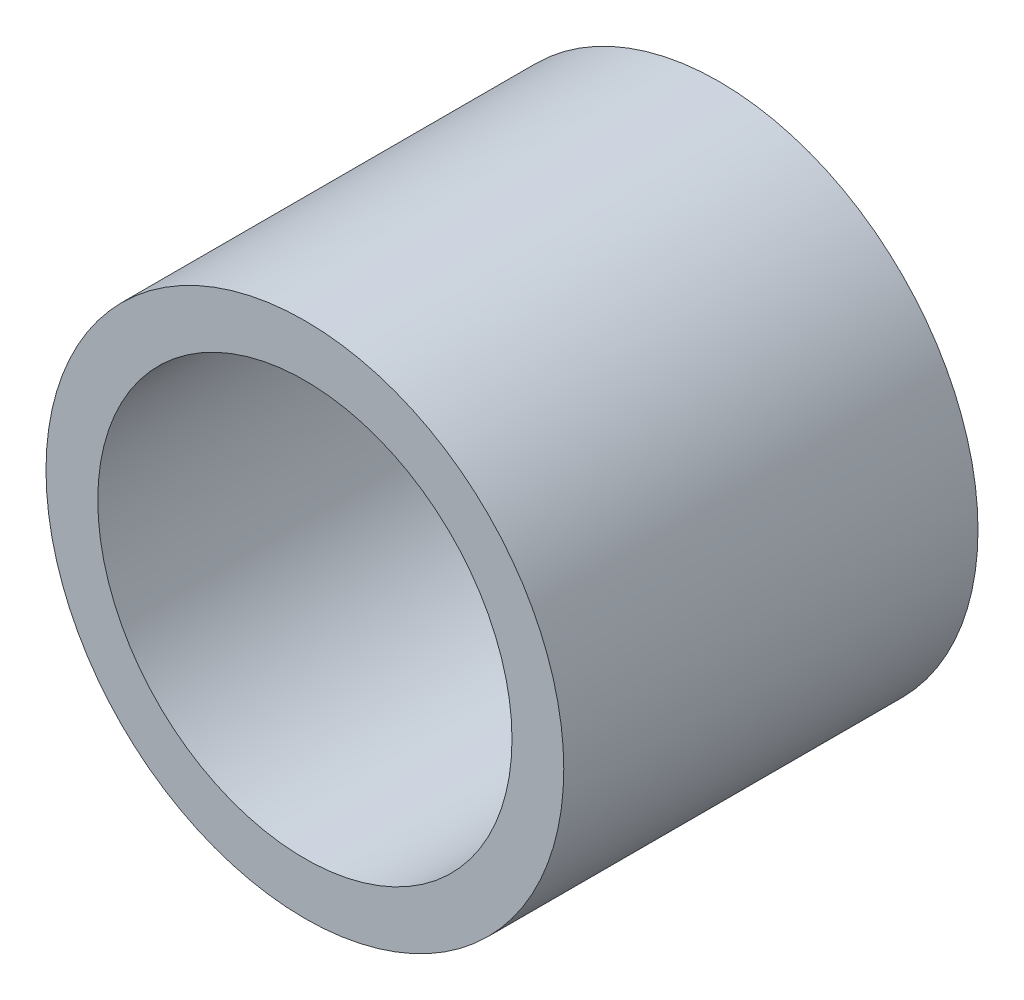
ISO-10303-21;
HEADER;
FILE_DESCRIPTION(('STEP AP214'),'2;1');
FILE_NAME('part.step','',(''),(''),'','','');
FILE_SCHEMA(('AUTOMOTIVE_DESIGN { 1 0 10303 214 1 1 1 1 }'));
ENDSEC;
DATA;
#1=APPLICATION_CONTEXT('core data for automotive mechanical design processes');
#2=APPLICATION_PROTOCOL_DEFINITION('international standard','automotive_design',2000,#1);
#3=PRODUCT_CONTEXT('',#1,'mechanical');
#4=PRODUCT('Part','Part','',(#3));
#5=PRODUCT_RELATED_PRODUCT_CATEGORY('part','',(#4));
#6=PRODUCT_DEFINITION_FORMATION('','',#4);
#7=PRODUCT_DEFINITION_CONTEXT('part definition',#1,'design');
#8=PRODUCT_DEFINITION('design','',#6,#7);
#9=PRODUCT_DEFINITION_SHAPE('','',#8);
#10=(LENGTH_UNIT() NAMED_UNIT(*) SI_UNIT(.MILLI.,.METRE.));
#11=(NAMED_UNIT(*) PLANE_ANGLE_UNIT() SI_UNIT($,.RADIAN.));
#12=(NAMED_UNIT(*) SI_UNIT($,.STERADIAN.) SOLID_ANGLE_UNIT());
#13=UNCERTAINTY_MEASURE_WITH_UNIT(LENGTH_MEASURE(1.E-05),#10,'distance_accuracy_value','');
#14=(GEOMETRIC_REPRESENTATION_CONTEXT(3) GLOBAL_UNCERTAINTY_ASSIGNED_CONTEXT((#13)) GLOBAL_UNIT_ASSIGNED_CONTEXT((#10,
#11,#12)) REPRESENTATION_CONTEXT('',''));
#15=CARTESIAN_POINT('',(0.,0.,0.));
#16=DIRECTION('',(0.,0.,1.));
#17=DIRECTION('',(1.,0.,0.));
#18=AXIS2_PLACEMENT_3D('',#15,#16,#17);
#19=CARTESIAN_POINT('',(0.,63.6713610367748,12.));
#20=DIRECTION('',(0.,0.,1.));
#21=DIRECTION('',(1.,0.,0.));
#22=AXIS2_PLACEMENT_3D('',#19,#20,#21);
#23=PLANE('',#22);
#24=CARTESIAN_POINT('',(0.,63.6713610367748,12.));
#25=DIRECTION('',(0.,0.,1.));
#26=DIRECTION('',(1.,0.,0.));
#27=AXIS2_PLACEMENT_3D('',#24,#25,#26);
#28=CIRCLE('',#27,7.49999999999994);
#29=CARTESIAN_POINT('',(7.49999999999997,63.6713610367748,12.));
#30=VERTEX_POINT('',#29);
#31=EDGE_CURVE('E10',#30,#30,#28,.T.);
#32=ORIENTED_EDGE('',*,*,#31,.T.);
#33=EDGE_LOOP('',(#32));
#34=FACE_BOUND('',#33,.T.);
#35=CARTESIAN_POINT('',(0.,63.6713610367748,12.));
#36=DIRECTION('',(0.,0.,1.));
#37=DIRECTION('',(1.,0.,0.));
#38=AXIS2_PLACEMENT_3D('',#35,#36,#37);
#39=CIRCLE('',#38,5.99999999999991);
#40=CARTESIAN_POINT('',(5.99999999999994,63.6713610367748,12.));
#41=VERTEX_POINT('',#40);
#42=EDGE_CURVE('E44',#41,#41,#39,.T.);
#43=ORIENTED_EDGE('',*,*,#42,.F.);
#44=EDGE_LOOP('',(#43));
#45=FACE_BOUND('',#44,.T.);
#46=ADVANCED_FACE('F33',(#34,#45),#23,.T.);
#47=CARTESIAN_POINT('',(0.,63.6713610367748,0.));
#48=DIRECTION('',(0.,0.,1.));
#49=DIRECTION('',(1.,0.,0.));
#50=AXIS2_PLACEMENT_3D('',#47,#48,#49);
#51=PLANE('',#50);
#52=CARTESIAN_POINT('',(0.,63.6713610367748,0.));
#53=DIRECTION('',(0.,0.,1.));
#54=DIRECTION('',(1.,0.,0.));
#55=AXIS2_PLACEMENT_3D('',#52,#53,#54);
#56=CIRCLE('',#55,7.49999999999994);
#57=CARTESIAN_POINT('',(7.49999999999997,63.6713610367748,0.));
#58=VERTEX_POINT('',#57);
#59=EDGE_CURVE('E40',#58,#58,#56,.T.);
#60=ORIENTED_EDGE('',*,*,#59,.F.);
#61=EDGE_LOOP('',(#60));
#62=FACE_BOUND('',#61,.T.);
#63=CARTESIAN_POINT('',(0.,63.6713610367748,0.));
#64=DIRECTION('',(0.,0.,1.));
#65=DIRECTION('',(1.,0.,0.));
#66=AXIS2_PLACEMENT_3D('',#63,#64,#65);
#67=CIRCLE('',#66,5.99999999999991);
#68=CARTESIAN_POINT('',(5.99999999999994,63.6713610367748,0.));
#69=VERTEX_POINT('',#68);
#70=EDGE_CURVE('E48',#69,#69,#67,.T.);
#71=ORIENTED_EDGE('',*,*,#70,.T.);
#72=EDGE_LOOP('',(#71));
#73=FACE_BOUND('',#72,.T.);
#74=ADVANCED_FACE('F54',(#62,#73),#51,.F.);
#75=CARTESIAN_POINT('',(0.,63.6713610367748,12.));
#76=DIRECTION('',(0.,0.,-1.));
#77=DIRECTION('',(-1.,0.,0.));
#78=AXIS2_PLACEMENT_3D('',#75,#76,#77);
#79=CYLINDRICAL_SURFACE('',#78,7.49999999999994);
#80=ORIENTED_EDGE('',*,*,#31,.F.);
#81=EDGE_LOOP('',(#80));
#82=FACE_BOUND('',#81,.T.);
#83=ORIENTED_EDGE('',*,*,#59,.T.);
#84=EDGE_LOOP('',(#83));
#85=FACE_BOUND('',#84,.T.);
#86=ADVANCED_FACE('F35',(#82,#85),#79,.T.);
#87=CARTESIAN_POINT('',(0.,63.6713610367748,12.));
#88=DIRECTION('',(0.,0.,-1.));
#89=DIRECTION('',(-1.,0.,0.));
#90=AXIS2_PLACEMENT_3D('',#87,#88,#89);
#91=CYLINDRICAL_SURFACE('',#90,5.99999999999991);
#92=ORIENTED_EDGE('',*,*,#42,.T.);
#93=EDGE_LOOP('',(#92));
#94=FACE_BOUND('',#93,.T.);
#95=ORIENTED_EDGE('',*,*,#70,.F.);
#96=EDGE_LOOP('',(#95));
#97=FACE_BOUND('',#96,.T.);
#98=ADVANCED_FACE('F56',(#94,#97),#91,.F.);
#99=CLOSED_SHELL('',(#46,#74,#86,#98));
#100=MANIFOLD_SOLID_BREP('B2',#99);
#101=ADVANCED_BREP_SHAPE_REPRESENTATION('',(#18,#100),#14);
#102=SHAPE_DEFINITION_REPRESENTATION(#9,#101);
ENDSEC;
END-ISO-10303-21;
